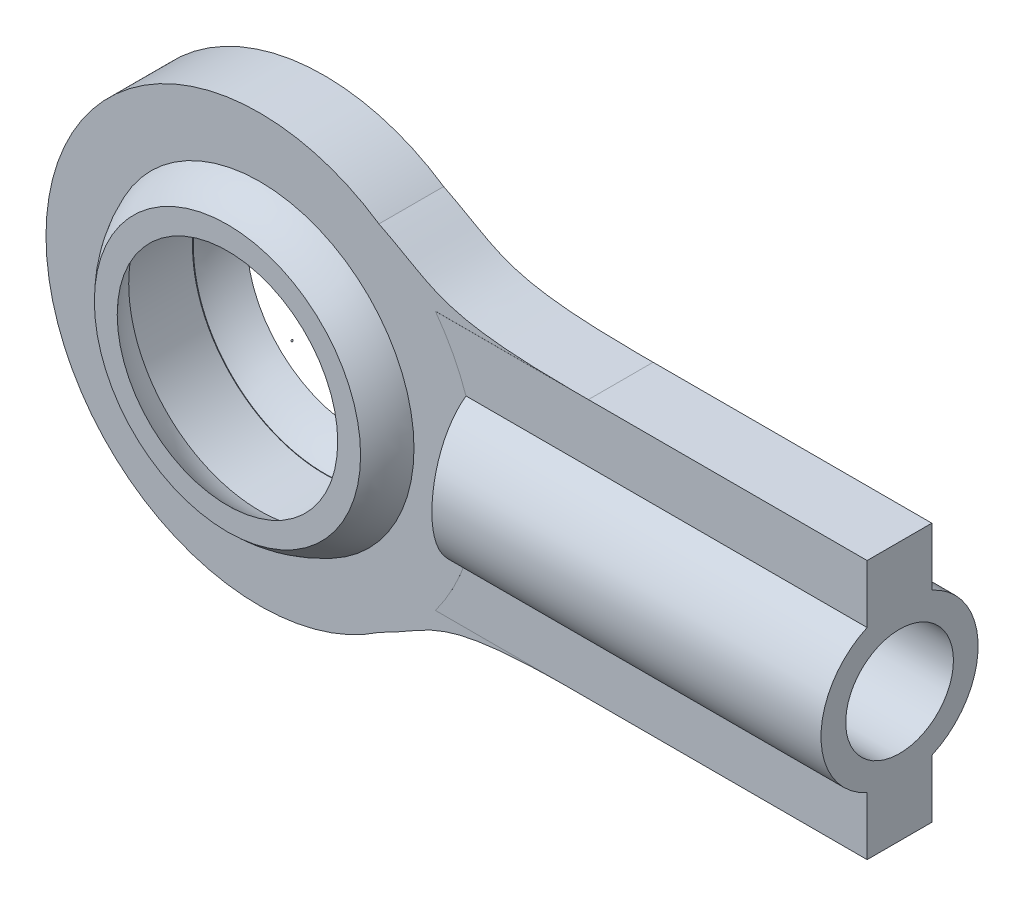
ISO-10303-21;
HEADER;
FILE_DESCRIPTION(('STEP AP214'),'2;1');
FILE_NAME('part.step','',(''),(''),'','','');
FILE_SCHEMA(('AUTOMOTIVE_DESIGN { 1 0 10303 214 1 1 1 1 }'));
ENDSEC;
DATA;
#1=APPLICATION_CONTEXT('core data for automotive mechanical design processes');
#2=APPLICATION_PROTOCOL_DEFINITION('international standard','automotive_design',2000,#1);
#3=PRODUCT_CONTEXT('',#1,'mechanical');
#4=PRODUCT('Part','Part','',(#3));
#5=PRODUCT_RELATED_PRODUCT_CATEGORY('part','',(#4));
#6=PRODUCT_DEFINITION_FORMATION('','',#4);
#7=PRODUCT_DEFINITION_CONTEXT('part definition',#1,'design');
#8=PRODUCT_DEFINITION('design','',#6,#7);
#9=PRODUCT_DEFINITION_SHAPE('','',#8);
#10=(LENGTH_UNIT() NAMED_UNIT(*) SI_UNIT(.MILLI.,.METRE.));
#11=(NAMED_UNIT(*) PLANE_ANGLE_UNIT() SI_UNIT($,.RADIAN.));
#12=(NAMED_UNIT(*) SI_UNIT($,.STERADIAN.) SOLID_ANGLE_UNIT());
#13=UNCERTAINTY_MEASURE_WITH_UNIT(LENGTH_MEASURE(1.E-05),#10,'distance_accuracy_value','');
#14=(GEOMETRIC_REPRESENTATION_CONTEXT(3) GLOBAL_UNCERTAINTY_ASSIGNED_CONTEXT((#13)) GLOBAL_UNIT_ASSIGNED_CONTEXT((#10,
#11,#12)) REPRESENTATION_CONTEXT('',''));
#15=CARTESIAN_POINT('',(0.,0.,0.));
#16=DIRECTION('',(0.,0.,1.));
#17=DIRECTION('',(1.,0.,0.));
#18=AXIS2_PLACEMENT_3D('',#15,#16,#17);
#19=CARTESIAN_POINT('',(0.,0.,5.));
#20=DIRECTION('',(0.,1.,0.));
#21=DIRECTION('',(1.,0.,0.));
#22=AXIS2_PLACEMENT_3D('',#19,#20,#21);
#23=SPHERICAL_SURFACE('',#22,0.05);
#24=CARTESIAN_POINT('',(0.,0.05,5.));
#25=VERTEX_POINT('',#24);
#26=VERTEX_LOOP('',#25);
#27=FACE_BOUND('',#26,.T.);
#28=ADVANCED_FACE('F40',(#27),#23,.T.);
#29=CLOSED_SHELL('',(#28));
#30=MANIFOLD_SOLID_BREP('B2',#29);
#31=CARTESIAN_POINT('',(0.,0.,7.));
#32=DIRECTION('',(0.,0.,1.));
#33=DIRECTION('',(1.,0.,0.));
#34=AXIS2_PLACEMENT_3D('',#31,#32,#33);
#35=PLANE('',#34);
#36=CARTESIAN_POINT('',(7.37205146484224,-10.9375023291297,7.));
#37=CARTESIAN_POINT('',(11.0593458509453,-9.11243969688908,7.));
#38=CARTESIAN_POINT('',(10.9360967991036,-7.96093691669476,7.));
#39=CARTESIAN_POINT('',(20.3264482536482,-8.00974694230661,7.));
#40=B_SPLINE_CURVE_WITH_KNOTS('',3,(#36,#37,#38,#39),.UNSPECIFIED.,.F.,.F.,(4,4),(0.,1.),.UNSPECIFIED.);
#41=CARTESIAN_POINT('',(7.37205146484224,-10.9375023291297,7.));
#42=VERTEX_POINT('',#41);
#43=CARTESIAN_POINT('',(19.2208446692394,-8.00974694230661,7.));
#44=VERTEX_POINT('',#43);
#45=EDGE_CURVE('E209',#42,#44,#40,.T.);
#46=ORIENTED_EDGE('',*,*,#45,.T.);
#47=DIRECTION('',(-1.,0.,0.));
#48=VECTOR('',#47,1.);
#49=CARTESIAN_POINT('',(37.55984811,-8.00974694230661,7.));
#50=LINE('',#49,#48);
#51=CARTESIAN_POINT('',(10.8671042104238,-8.00974694230661,7.));
#52=VERTEX_POINT('',#51);
#53=EDGE_CURVE('E944',#44,#52,#50,.T.);
#54=ORIENTED_EDGE('',*,*,#53,.T.);
#55=CARTESIAN_POINT('',(0.,0.,7.));
#56=DIRECTION('',(0.,0.,1.));
#57=DIRECTION('',(1.,0.,0.));
#58=AXIS2_PLACEMENT_3D('',#55,#56,#57);
#59=CIRCLE('',#58,13.5);
#60=CARTESIAN_POINT('',(10.8671042104238,8.00974694230661,7.));
#61=VERTEX_POINT('',#60);
#62=EDGE_CURVE('E430',#52,#61,#59,.T.);
#63=ORIENTED_EDGE('',*,*,#62,.T.);
#64=DIRECTION('',(-1.,0.,0.));
#65=VECTOR('',#64,1.);
#66=CARTESIAN_POINT('',(37.55984811,8.00974694230661,7.));
#67=LINE('',#66,#65);
#68=CARTESIAN_POINT('',(19.2208446691944,8.00974694230661,7.));
#69=VERTEX_POINT('',#68);
#70=EDGE_CURVE('E446',#69,#61,#67,.T.);
#71=ORIENTED_EDGE('',*,*,#70,.F.);
#72=CARTESIAN_POINT('',(20.3264482536482,8.00974694230661,7.));
#73=CARTESIAN_POINT('',(10.9360967991036,7.96093691669476,7.));
#74=CARTESIAN_POINT('',(11.0593458509453,9.11243969688909,7.));
#75=CARTESIAN_POINT('',(7.37205146484224,10.9375023291297,7.));
#76=B_SPLINE_CURVE_WITH_KNOTS('',3,(#72,#73,#74,#75),.UNSPECIFIED.,.F.,.F.,(4,4),(0.,1.),.UNSPECIFIED.);
#77=CARTESIAN_POINT('',(7.37205146484224,10.9375023291297,7.));
#78=VERTEX_POINT('',#77);
#79=EDGE_CURVE('E282',#69,#78,#76,.T.);
#80=ORIENTED_EDGE('',*,*,#79,.T.);
#81=CARTESIAN_POINT('',(-0.0169719174198894,0.,7.));
#82=DIRECTION('',(0.,0.,1.));
#83=DIRECTION('',(1.,0.,0.));
#84=AXIS2_PLACEMENT_3D('',#81,#82,#83);
#85=CIRCLE('',#84,13.1994933138865);
#86=EDGE_CURVE('E435',#78,#42,#85,.T.);
#87=ORIENTED_EDGE('',*,*,#86,.T.);
#88=EDGE_LOOP('',(#46,#54,#63,#71,#80,#87));
#89=FACE_BOUND('',#88,.T.);
#90=CARTESIAN_POINT('',(0.0106908193794938,0.,7.));
#91=DIRECTION('',(0.,0.,1.));
#92=DIRECTION('',(1.,0.,0.));
#93=AXIS2_PLACEMENT_3D('',#90,#91,#92);
#94=CIRCLE('',#93,9.52641269359551);
#95=CARTESIAN_POINT('',(9.537103512975,0.,7.));
#96=VERTEX_POINT('',#95);
#97=EDGE_CURVE('E951',#96,#96,#94,.F.);
#98=ORIENTED_EDGE('',*,*,#97,.T.);
#99=EDGE_LOOP('',(#98));
#100=FACE_BOUND('',#99,.T.);
#101=ADVANCED_FACE('F52',(#89,#100),#35,.T.);
#102=CARTESIAN_POINT('',(0.,0.,3.));
#103=DIRECTION('',(0.,0.,-1.));
#104=DIRECTION('',(-1.,0.,0.));
#105=AXIS2_PLACEMENT_3D('',#102,#103,#104);
#106=PLANE('',#105);
#107=DIRECTION('',(-1.,0.,0.));
#108=VECTOR('',#107,1.);
#109=CARTESIAN_POINT('',(0.,-8.00974694230661,3.));
#110=LINE('',#109,#108);
#111=CARTESIAN_POINT('',(19.220844669194,-8.00974694230661,3.));
#112=VERTEX_POINT('',#111);
#113=CARTESIAN_POINT('',(8.55982311,-8.00974694230661,3.));
#114=VERTEX_POINT('',#113);
#115=EDGE_CURVE('E212',#112,#114,#110,.T.);
#116=ORIENTED_EDGE('',*,*,#115,.F.);
#117=CARTESIAN_POINT('',(7.37205146484224,-10.9375023291297,3.));
#118=CARTESIAN_POINT('',(11.0593458509453,-9.11243969688908,3.));
#119=CARTESIAN_POINT('',(10.9360967991036,-7.96093691669476,3.));
#120=CARTESIAN_POINT('',(20.3264482536482,-8.00974694230661,3.));
#121=B_SPLINE_CURVE_WITH_KNOTS('',3,(#117,#118,#119,#120),.UNSPECIFIED.,.F.,.F.,(4,4),(0.,1.),.UNSPECIFIED.);
#122=CARTESIAN_POINT('',(7.37205146484224,-10.9375023291297,3.));
#123=VERTEX_POINT('',#122);
#124=EDGE_CURVE('E196',#112,#123,#121,.F.);
#125=ORIENTED_EDGE('',*,*,#124,.T.);
#126=CARTESIAN_POINT('',(-0.0169719174198894,0.,3.));
#127=DIRECTION('',(0.,0.,-1.));
#128=DIRECTION('',(-1.,0.,0.));
#129=AXIS2_PLACEMENT_3D('',#126,#127,#128);
#130=CIRCLE('',#129,13.1994933138865);
#131=CARTESIAN_POINT('',(7.37205146484224,10.9375023291297,3.));
#132=VERTEX_POINT('',#131);
#133=EDGE_CURVE('E422',#123,#132,#130,.T.);
#134=ORIENTED_EDGE('',*,*,#133,.T.);
#135=CARTESIAN_POINT('',(20.3264482536482,8.00974694230661,3.));
#136=CARTESIAN_POINT('',(10.9360967991036,7.96093691669476,3.));
#137=CARTESIAN_POINT('',(11.0593458509453,9.11243969688909,3.));
#138=CARTESIAN_POINT('',(7.37205146484224,10.9375023291297,3.));
#139=B_SPLINE_CURVE_WITH_KNOTS('',3,(#135,#136,#137,#138),.UNSPECIFIED.,.F.,.F.,(4,4),(0.,1.),.UNSPECIFIED.);
#140=CARTESIAN_POINT('',(19.2208446691942,8.00974694230661,3.));
#141=VERTEX_POINT('',#140);
#142=EDGE_CURVE('E423',#132,#141,#139,.F.);
#143=ORIENTED_EDGE('',*,*,#142,.T.);
#144=DIRECTION('',(1.,0.,0.));
#145=VECTOR('',#144,1.);
#146=CARTESIAN_POINT('',(0.,8.00974694230661,3.));
#147=LINE('',#146,#145);
#148=CARTESIAN_POINT('',(8.55982311,8.00974694230661,3.));
#149=VERTEX_POINT('',#148);
#150=EDGE_CURVE('E225',#149,#141,#147,.T.);
#151=ORIENTED_EDGE('',*,*,#150,.F.);
#152=DIRECTION('',(0.,1.,0.));
#153=VECTOR('',#152,1.);
#154=CARTESIAN_POINT('',(8.55982311,0.,3.));
#155=LINE('',#154,#153);
#156=CARTESIAN_POINT('',(8.55982311,4.4218515655031,3.));
#157=VERTEX_POINT('',#156);
#158=EDGE_CURVE('E239',#157,#149,#155,.T.);
#159=ORIENTED_EDGE('',*,*,#158,.F.);
#160=DIRECTION('',(1.,0.,0.));
#161=VECTOR('',#160,1.);
#162=CARTESIAN_POINT('',(8.55982311,4.42185156550309,3.));
#163=LINE('',#162,#161);
#164=CARTESIAN_POINT('',(12.7552823854534,4.4218515655031,3.));
#165=VERTEX_POINT('',#164);
#166=EDGE_CURVE('E220',#165,#157,#163,.F.);
#167=ORIENTED_EDGE('',*,*,#166,.F.);
#168=CARTESIAN_POINT('',(0.,0.,3.));
#169=DIRECTION('',(0.,0.,-1.));
#170=DIRECTION('',(-1.,0.,0.));
#171=AXIS2_PLACEMENT_3D('',#168,#169,#170);
#172=CIRCLE('',#171,13.5);
#173=CARTESIAN_POINT('',(12.7552823854534,-4.4218515655031,3.));
#174=VERTEX_POINT('',#173);
#175=EDGE_CURVE('E419',#165,#174,#172,.T.);
#176=ORIENTED_EDGE('',*,*,#175,.T.);
#177=DIRECTION('',(1.,0.,0.));
#178=VECTOR('',#177,1.);
#179=CARTESIAN_POINT('',(8.55982311,-4.42185156550309,3.));
#180=LINE('',#179,#178);
#181=CARTESIAN_POINT('',(8.55982311,-4.4218515655031,3.));
#182=VERTEX_POINT('',#181);
#183=EDGE_CURVE('E377',#182,#174,#180,.T.);
#184=ORIENTED_EDGE('',*,*,#183,.F.);
#185=EDGE_CURVE('E216',#114,#182,#155,.T.);
#186=ORIENTED_EDGE('',*,*,#185,.F.);
#187=EDGE_LOOP('',(#116,#125,#134,#143,#151,#159,#167,#176,#184,#186));
#188=FACE_BOUND('',#187,.T.);
#189=CARTESIAN_POINT('',(0.0106908193794938,0.,3.));
#190=DIRECTION('',(0.,0.,-1.));
#191=DIRECTION('',(-1.,0.,0.));
#192=AXIS2_PLACEMENT_3D('',#189,#190,#191);
#193=CIRCLE('',#192,9.52641269359551);
#194=CARTESIAN_POINT('',(-9.51572187421601,0.,3.));
#195=VERTEX_POINT('',#194);
#196=EDGE_CURVE('E235',#195,#195,#193,.F.);
#197=ORIENTED_EDGE('',*,*,#196,.T.);
#198=EDGE_LOOP('',(#197));
#199=FACE_BOUND('',#198,.T.);
#200=ADVANCED_FACE('F213',(#188,#199),#106,.T.);
#201=CARTESIAN_POINT('',(7.37205146484224,-10.9375023291297,10.));
#202=CARTESIAN_POINT('',(11.0593458509453,-9.11243969688908,10.));
#203=CARTESIAN_POINT('',(10.9360967991036,-7.96093691669476,10.));
#204=CARTESIAN_POINT('',(20.3264482536482,-8.00974694230661,10.));
#205=B_SPLINE_CURVE_WITH_KNOTS('',3,(#201,#202,#203,#204),.UNSPECIFIED.,.F.,.F.,(4,4),(0.,1.),.UNSPECIFIED.);
#206=DIRECTION('',(0.,0.,-1.));
#207=VECTOR('',#206,1.);
#208=SURFACE_OF_LINEAR_EXTRUSION('',#205,#207);
#209=ORIENTED_EDGE('',*,*,#124,.F.);
#210=DIRECTION('',(0.,0.,-1.));
#211=VECTOR('',#210,1.);
#212=CARTESIAN_POINT('',(19.220844669194,-8.00974694230661,10.));
#213=LINE('',#212,#211);
#214=CARTESIAN_POINT('',(19.2208447685526,-8.00974694230661,3.00370256567817));
#215=VERTEX_POINT('',#214);
#216=EDGE_CURVE('E201',#112,#215,#213,.F.);
#217=ORIENTED_EDGE('',*,*,#216,.T.);
#218=CARTESIAN_POINT('',(19.220844768551,-8.00974694174832,3.00370256567817));
#219=CARTESIAN_POINT('',(19.574065785448,-8.0077621827985,3.00370256567817));
#220=CARTESIAN_POINT('',(19.9422962045934,-8.00775016173412,3.00370256567817));
#221=CARTESIAN_POINT('',(20.3264482536482,-8.00974694230661,3.00370256567817));
#222=B_SPLINE_CURVE_WITH_KNOTS('',3,(#218,#219,#220,#221),.UNSPECIFIED.,.F.,.F.,(4,4),
(0.959090769827478,1.),.UNSPECIFIED.);
#223=CARTESIAN_POINT('',(20.3264482536482,-8.00974694230661,3.00370256567817));
#224=VERTEX_POINT('',#223);
#225=EDGE_CURVE('E243',#215,#224,#222,.T.);
#226=ORIENTED_EDGE('',*,*,#225,.T.);
#227=DIRECTION('',(0.,0.,-1.));
#228=VECTOR('',#227,1.);
#229=CARTESIAN_POINT('',(20.3264482536482,-8.00974694230661,10.));
#230=LINE('',#229,#228);
#231=CARTESIAN_POINT('',(20.3264482536482,-8.00974694230661,7.00411892586494));
#232=VERTEX_POINT('',#231);
#233=EDGE_CURVE('E285',#232,#224,#230,.T.);
#234=ORIENTED_EDGE('',*,*,#233,.F.);
#235=CARTESIAN_POINT('',(20.3264482536482,-8.00974694230661,7.00411892586494));
#236=CARTESIAN_POINT('',(19.9422961685742,-8.0077501615469,7.00411892586494));
#237=CARTESIAN_POINT('',(19.5740657163953,-8.00776218280075,7.00411892586494));
#238=CARTESIAN_POINT('',(19.220844669194,-8.00974694230661,7.00411892586494));
#239=B_SPLINE_CURVE_WITH_KNOTS('',3,(#235,#236,#237,#238),.UNSPECIFIED.,.F.,.F.,(4,4),
(0.959090765991712,1.),.UNSPECIFIED.);
#240=CARTESIAN_POINT('',(19.220844669194,-8.00974694230661,7.00411892586494));
#241=VERTEX_POINT('',#240);
#242=EDGE_CURVE('E523',#241,#232,#239,.F.);
#243=ORIENTED_EDGE('',*,*,#242,.F.);
#244=DIRECTION('',(0.,0.,-1.));
#245=VECTOR('',#244,1.);
#246=CARTESIAN_POINT('',(19.2208446692394,-8.00974694230635,10.));
#247=LINE('',#246,#245);
#248=EDGE_CURVE('E938',#44,#241,#247,.F.);
#249=ORIENTED_EDGE('',*,*,#248,.F.);
#250=ORIENTED_EDGE('',*,*,#45,.F.);
#251=DIRECTION('',(0.,0.,-1.));
#252=VECTOR('',#251,1.);
#253=CARTESIAN_POINT('',(7.37205146484224,-10.9375023291297,10.));
#254=LINE('',#253,#252);
#255=EDGE_CURVE('E205',#42,#123,#254,.T.);
#256=ORIENTED_EDGE('',*,*,#255,.T.);
#257=EDGE_LOOP('',(#209,#217,#226,#234,#243,#249,#250,#256));
#258=FACE_BOUND('',#257,.T.);
#259=ADVANCED_FACE('F198',(#258),#208,.F.);
#260=CARTESIAN_POINT('',(8.55982311,-8.00974694230661,10.));
#261=DIRECTION('',(0.,-1.,0.));
#262=DIRECTION('',(0.,0.,-1.));
#263=AXIS2_PLACEMENT_3D('',#260,#261,#262);
#264=PLANE('',#263);
#265=ORIENTED_EDGE('',*,*,#216,.F.);
#266=ORIENTED_EDGE('',*,*,#115,.T.);
#267=DIRECTION('',(0.,0.,-1.));
#268=VECTOR('',#267,1.);
#269=CARTESIAN_POINT('',(8.55982311,-8.00974694230661,10.));
#270=LINE('',#269,#268);
#271=CARTESIAN_POINT('',(8.55982311,-8.00974694230661,3.00370256567817));
#272=VERTEX_POINT('',#271);
#273=EDGE_CURVE('E383',#272,#114,#270,.T.);
#274=ORIENTED_EDGE('',*,*,#273,.F.);
#275=DIRECTION('',(1.,0.,0.));
#276=VECTOR('',#275,1.);
#277=CARTESIAN_POINT('',(8.55982311,-8.00974694230661,3.00370256567817));
#278=LINE('',#277,#276);
#279=EDGE_CURVE('E224',#272,#215,#278,.T.);
#280=ORIENTED_EDGE('',*,*,#279,.T.);
#281=EDGE_LOOP('',(#265,#266,#274,#280));
#282=FACE_BOUND('',#281,.T.);
#283=ADVANCED_FACE('F223',(#282),#264,.F.);
#284=CARTESIAN_POINT('',(20.3264482536482,8.00974694230661,10.));
#285=CARTESIAN_POINT('',(10.9360967991036,7.96093691669476,10.));
#286=CARTESIAN_POINT('',(11.0593458509453,9.11243969688909,10.));
#287=CARTESIAN_POINT('',(7.37205146484224,10.9375023291297,10.));
#288=B_SPLINE_CURVE_WITH_KNOTS('',3,(#284,#285,#286,#287),.UNSPECIFIED.,.F.,.F.,(4,4),(0.,1.),.UNSPECIFIED.);
#289=DIRECTION('',(0.,0.,-1.));
#290=VECTOR('',#289,1.);
#291=SURFACE_OF_LINEAR_EXTRUSION('',#288,#290);
#292=DIRECTION('',(0.,0.,-1.));
#293=VECTOR('',#292,1.);
#294=CARTESIAN_POINT('',(19.2208446691942,8.00974694230661,10.));
#295=LINE('',#294,#293);
#296=CARTESIAN_POINT('',(19.2208446691942,8.00974694230661,3.00370256567817));
#297=VERTEX_POINT('',#296);
#298=EDGE_CURVE('E228',#297,#141,#295,.T.);
#299=ORIENTED_EDGE('',*,*,#298,.T.);
#300=ORIENTED_EDGE('',*,*,#142,.F.);
#301=DIRECTION('',(0.,0.,-1.));
#302=VECTOR('',#301,1.);
#303=CARTESIAN_POINT('',(7.37205146484224,10.9375023291297,10.));
#304=LINE('',#303,#302);
#305=EDGE_CURVE('E294',#78,#132,#304,.T.);
#306=ORIENTED_EDGE('',*,*,#305,.F.);
#307=ORIENTED_EDGE('',*,*,#79,.F.);
#308=DIRECTION('',(0.,0.,-1.));
#309=VECTOR('',#308,1.);
#310=CARTESIAN_POINT('',(19.2208446691944,8.0097469423066,10.));
#311=LINE('',#310,#309);
#312=CARTESIAN_POINT('',(19.2208447810846,8.00974694230661,7.00411892586494));
#313=VERTEX_POINT('',#312);
#314=EDGE_CURVE('E930',#313,#69,#311,.T.);
#315=ORIENTED_EDGE('',*,*,#314,.F.);
#316=CARTESIAN_POINT('',(19.2208447810828,8.0097469416779,7.00411892586494));
#317=CARTESIAN_POINT('',(19.5740657941575,8.00776218279821,7.00411892586494));
#318=CARTESIAN_POINT('',(19.9422962091365,8.00775016175774,7.00411892586494));
#319=CARTESIAN_POINT('',(20.3264482536482,8.00974694230661,7.00411892586494));
#320=B_SPLINE_CURVE_WITH_KNOTS('',3,(#316,#317,#318,#319),.UNSPECIFIED.,.F.,.F.,(4,4),(0.,
0.0409092296887205),.UNSPECIFIED.);
#321=CARTESIAN_POINT('',(20.3264482536482,8.00974694230661,7.00411892586494));
#322=VERTEX_POINT('',#321);
#323=EDGE_CURVE('E395',#313,#322,#320,.T.);
#324=ORIENTED_EDGE('',*,*,#323,.T.);
#325=DIRECTION('',(0.,0.,-1.));
#326=VECTOR('',#325,1.);
#327=CARTESIAN_POINT('',(20.3264482536482,8.00974694230661,10.));
#328=LINE('',#327,#326);
#329=CARTESIAN_POINT('',(20.3264482536482,8.00974694230661,3.00370256567817));
#330=VERTEX_POINT('',#329);
#331=EDGE_CURVE('E279',#322,#330,#328,.T.);
#332=ORIENTED_EDGE('',*,*,#331,.T.);
#333=CARTESIAN_POINT('',(20.3264482536482,8.00974694230661,3.00370256567817));
#334=CARTESIAN_POINT('',(19.9422961685743,8.0077501615469,3.00370256567817));
#335=CARTESIAN_POINT('',(19.5740657163954,8.00776218280075,3.00370256567817));
#336=CARTESIAN_POINT('',(19.2208446691942,8.0097469423066,3.00370256567817));
#337=B_SPLINE_CURVE_WITH_KNOTS('',3,(#333,#334,#335,#336),.UNSPECIFIED.,.F.,.F.,(4,4),(0.,
0.0409092340082806),.UNSPECIFIED.);
#338=EDGE_CURVE('E425',#297,#330,#337,.F.);
#339=ORIENTED_EDGE('',*,*,#338,.F.);
#340=EDGE_LOOP('',(#299,#300,#306,#307,#315,#324,#332,#339));
#341=FACE_BOUND('',#340,.T.);
#342=ADVANCED_FACE('F54',(#341),#291,.F.);
#343=CARTESIAN_POINT('',(8.55982311,8.00974694230661,10.));
#344=DIRECTION('',(0.,1.,0.));
#345=DIRECTION('',(0.,0.,1.));
#346=AXIS2_PLACEMENT_3D('',#343,#344,#345);
#347=PLANE('',#346);
#348=ORIENTED_EDGE('',*,*,#150,.T.);
#349=ORIENTED_EDGE('',*,*,#298,.F.);
#350=DIRECTION('',(1.,0.,0.));
#351=VECTOR('',#350,1.);
#352=CARTESIAN_POINT('',(8.55982311,8.00974694230661,3.00370256567817));
#353=LINE('',#352,#351);
#354=CARTESIAN_POINT('',(8.55982311,8.00974694230661,3.00370256567817));
#355=VERTEX_POINT('',#354);
#356=EDGE_CURVE('E348',#355,#297,#353,.T.);
#357=ORIENTED_EDGE('',*,*,#356,.F.);
#358=DIRECTION('',(0.,0.,1.));
#359=VECTOR('',#358,1.);
#360=CARTESIAN_POINT('',(8.55982311,8.00974694230661,10.));
#361=LINE('',#360,#359);
#362=EDGE_CURVE('E379',#149,#355,#361,.T.);
#363=ORIENTED_EDGE('',*,*,#362,.F.);
#364=EDGE_LOOP('',(#348,#349,#357,#363));
#365=FACE_BOUND('',#364,.T.);
#366=ADVANCED_FACE('F457',(#365),#347,.F.);
#367=CARTESIAN_POINT('',(0.,0.,7.));
#368=DIRECTION('',(0.,0.,1.));
#369=DIRECTION('',(1.,0.,0.));
#370=AXIS2_PLACEMENT_3D('',#367,#368,#369);
#371=CYLINDRICAL_SURFACE('',#370,13.5);
#372=DIRECTION('',(0.,0.,1.));
#373=VECTOR('',#372,1.);
#374=CARTESIAN_POINT('',(10.8671042104238,-8.00974694230661,7.));
#375=LINE('',#374,#373);
#376=CARTESIAN_POINT('',(10.8671042104238,-8.0097469423066,7.00411892586494));
#377=VERTEX_POINT('',#376);
#378=EDGE_CURVE('E940',#377,#52,#375,.F.);
#379=ORIENTED_EDGE('',*,*,#378,.F.);
#380=CARTESIAN_POINT('',(0.,0.,7.00411892586494));
#381=DIRECTION('',(0.,0.,-1.));
#382=DIRECTION('',(-1.,0.,0.));
#383=AXIS2_PLACEMENT_3D('',#380,#381,#382);
#384=CIRCLE('',#383,13.5);
#385=CARTESIAN_POINT('',(12.7559326778641,-4.41997528474984,7.00411892586494));
#386=VERTEX_POINT('',#385);
#387=EDGE_CURVE('E460',#377,#386,#384,.F.);
#388=ORIENTED_EDGE('',*,*,#387,.T.);
#389=CARTESIAN_POINT('',(12.7559326778641,-4.41997528474984,7.00411892586494));
#390=CARTESIAN_POINT('',(12.775705650682,-4.36289578377834,7.13029864547706));
#391=CARTESIAN_POINT('',(12.7969051174868,-4.30049207015343,7.2538191842831));
#392=CARTESIAN_POINT('',(12.8414557879072,-4.16558435745821,7.49477085575706));
#393=CARTESIAN_POINT('',(12.8648064637079,-4.09308283373741,7.61220347114995));
#394=CARTESIAN_POINT('',(12.9129642212096,-3.9385134287035,7.84024971511158));
#395=CARTESIAN_POINT('',(12.9377710337109,-3.85644731287382,7.95086459638923));
#396=CARTESIAN_POINT('',(12.9881173733226,-3.6833345347328,8.16460687199905));
#397=CARTESIAN_POINT('',(13.0136569391162,-3.59228739767969,8.26773387001678));
#398=CARTESIAN_POINT('',(13.0902783046206,-3.30656347783153,8.56485920212877));
#399=CARTESIAN_POINT('',(13.1414217769601,-3.09912295664896,8.74686853850512));
#400=CARTESIAN_POINT('',(13.2381529727527,-2.65570424252907,9.07354590740568));
#401=CARTESIAN_POINT('',(13.2837417611495,-2.41973153711903,9.21822110359359));
#402=CARTESIAN_POINT('',(13.3643506131678,-1.92528549634709,9.46583023492882));
#403=CARTESIAN_POINT('',(13.3993795128284,-1.66683120723684,9.56879909299111));
#404=CARTESIAN_POINT('',(13.4548840102074,-1.13469172454707,9.72926822734534));
#405=CARTESIAN_POINT('',(13.4753645642969,-0.861011752392736,9.78678398947713));
#406=CARTESIAN_POINT('',(13.4987196965146,-0.321776504454009,9.85218563140119));
#407=CARTESIAN_POINT('',(13.5024675839306,-0.0565563115605997,9.86253390951769));
#408=CARTESIAN_POINT('',(13.4943398772328,0.471751344683003,9.83990000934661));
#409=CARTESIAN_POINT('',(13.4824668874726,0.734839156192088,9.80692505402321));
#410=CARTESIAN_POINT('',(13.4449075910056,1.24418758295289,9.70042592714622));
#411=CARTESIAN_POINT('',(13.4195991631196,1.49071004643317,9.62800968175307));
#412=CARTESIAN_POINT('',(13.3579429130185,1.96808170581312,9.44587878996692));
#413=CARTESIAN_POINT('',(13.3215928880393,2.19892776306482,9.33615670065309));
#414=CARTESIAN_POINT('',(13.2398821150292,2.64752592214533,9.07806959837262));
#415=CARTESIAN_POINT('',(13.194244284491,2.86450836585545,8.92845657223373));
#416=CARTESIAN_POINT('',(13.0993953356079,3.2710042955779,8.59665291898449));
#417=CARTESIAN_POINT('',(13.0501839718066,3.4605158920078,8.41446005279307));
#418=CARTESIAN_POINT('',(12.9569577532659,3.7940535247645,8.03726896788594));
#419=CARTESIAN_POINT('',(12.9128407308412,3.94049747364894,7.84443911298701));
#420=CARTESIAN_POINT('',(12.8504740543675,4.13764188681566,7.5400582479703));
#421=CARTESIAN_POINT('',(12.8303162985741,4.19961330984447,7.43605282386376));
#422=CARTESIAN_POINT('',(12.7917203160716,4.31573986599587,7.2234288874175));
#423=CARTESIAN_POINT('',(12.7732825010558,4.36989312941621,7.11480927961366));
#424=CARTESIAN_POINT('',(12.7559326778641,4.41997528474984,7.00411892586494));
#425=B_SPLINE_CURVE_WITH_KNOTS('',3,(#389,#390,#391,#392,#393,#394,#395,#396,#397,#398,#399,
#400,#401,#402,#403,#404,#405,#406,#407,#408,#409,#410,#411,#412,#413,#414,#415,#416,#417,#418,
#419,#420,#421,#422,#423,#424),.UNSPECIFIED.,.F.,.F.,(4,2,2,2,2,2,2,2,2,2,2,2,2,2,2,2,2,4),(0.,
0.419512140404784,0.838921623164709,1.25825381133197,1.67760817752219,2.51534571752146,
3.35292239296646,4.18979626414018,5.0263848898683,5.81875773953437,6.61099849946371,
7.38205357846034,8.15326258167202,8.95221172531813,9.75121579863581,10.4867213559907,
10.8546222441826,11.2226109701452),.UNSPECIFIED.);
#426=CARTESIAN_POINT('',(12.7559326778641,4.41997528474984,7.00411892586494));
#427=VERTEX_POINT('',#426);
#428=EDGE_CURVE('E462',#386,#427,#425,.T.);
#429=ORIENTED_EDGE('',*,*,#428,.T.);
#430=CARTESIAN_POINT('',(0.,0.,7.00411892586494));
#431=DIRECTION('',(0.,0.,-1.));
#432=DIRECTION('',(-1.,0.,0.));
#433=AXIS2_PLACEMENT_3D('',#430,#431,#432);
#434=CIRCLE('',#433,13.5);
#435=CARTESIAN_POINT('',(10.8671042104238,8.0097469423066,7.00411892586494));
#436=VERTEX_POINT('',#435);
#437=EDGE_CURVE('E283',#427,#436,#434,.F.);
#438=ORIENTED_EDGE('',*,*,#437,.T.);
#439=DIRECTION('',(0.,0.,1.));
#440=VECTOR('',#439,1.);
#441=CARTESIAN_POINT('',(10.8671042104238,8.00974694230661,7.));
#442=LINE('',#441,#440);
#443=EDGE_CURVE('E923',#61,#436,#442,.T.);
#444=ORIENTED_EDGE('',*,*,#443,.F.);
#445=ORIENTED_EDGE('',*,*,#62,.F.);
#446=EDGE_LOOP('',(#379,#388,#429,#438,#444,#445));
#447=FACE_BOUND('',#446,.T.);
#448=ADVANCED_FACE('F476',(#447),#371,.F.);
#449=CARTESIAN_POINT('',(-0.0169719174198894,0.,10.));
#450=DIRECTION('',(0.,0.,-1.));
#451=DIRECTION('',(-1.,0.,0.));
#452=AXIS2_PLACEMENT_3D('',#449,#450,#451);
#453=CYLINDRICAL_SURFACE('',#452,13.1994933138865);
#454=ORIENTED_EDGE('',*,*,#133,.F.);
#455=ORIENTED_EDGE('',*,*,#255,.F.);
#456=ORIENTED_EDGE('',*,*,#86,.F.);
#457=ORIENTED_EDGE('',*,*,#305,.T.);
#458=EDGE_LOOP('',(#454,#455,#456,#457));
#459=FACE_BOUND('',#458,.T.);
#460=ADVANCED_FACE('F261',(#459),#453,.T.);
#461=CARTESIAN_POINT('',(37.55982311,-8.00974694230661,10.));
#462=DIRECTION('',(0.,1.,0.));
#463=DIRECTION('',(0.,0.,1.));
#464=AXIS2_PLACEMENT_3D('',#461,#462,#463);
#465=PLANE('',#464);
#466=ORIENTED_EDGE('',*,*,#233,.T.);
#467=CARTESIAN_POINT('',(37.55982311,-8.00974694230661,3.00370256567817));
#468=VERTEX_POINT('',#467);
#469=EDGE_CURVE('E362',#224,#468,#278,.T.);
#470=ORIENTED_EDGE('',*,*,#469,.T.);
#471=DIRECTION('',(0.,0.,-1.));
#472=VECTOR('',#471,1.);
#473=CARTESIAN_POINT('',(37.55982311,-8.00974694230661,10.));
#474=LINE('',#473,#472);
#475=CARTESIAN_POINT('',(37.55982311,-8.00974694230661,7.00411892586494));
#476=VERTEX_POINT('',#475);
#477=EDGE_CURVE('E288',#476,#468,#474,.T.);
#478=ORIENTED_EDGE('',*,*,#477,.F.);
#479=DIRECTION('',(1.,0.,0.));
#480=VECTOR('',#479,1.);
#481=CARTESIAN_POINT('',(8.55982311,-8.00974694230661,7.00411892586494));
#482=LINE('',#481,#480);
#483=EDGE_CURVE('E501',#232,#476,#482,.T.);
#484=ORIENTED_EDGE('',*,*,#483,.F.);
#485=EDGE_LOOP('',(#466,#470,#478,#484));
#486=FACE_BOUND('',#485,.T.);
#487=ADVANCED_FACE('F259',(#486),#465,.F.);
#488=CARTESIAN_POINT('',(37.55982311,-8.00974694230661,10.));
#489=DIRECTION('',(-1.,0.,0.));
#490=DIRECTION('',(0.,0.,1.));
#491=AXIS2_PLACEMENT_3D('',#488,#489,#490);
#492=PLANE('',#491);
#493=CARTESIAN_POINT('',(37.55982311,0.,4.99740952804584));
#494=DIRECTION('',(1.,0.,0.));
#495=DIRECTION('',(0.,0.,-1.));
#496=AXIS2_PLACEMENT_3D('',#493,#494,#495);
#497=CIRCLE('',#496,3.33);
#498=CARTESIAN_POINT('',(37.55982311,0.,1.66740952804584));
#499=VERTEX_POINT('',#498);
#500=EDGE_CURVE('E948',#499,#499,#497,.T.);
#501=ORIENTED_EDGE('',*,*,#500,.F.);
#502=EDGE_LOOP('',(#501));
#503=FACE_BOUND('',#502,.T.);
#504=DIRECTION('',(0.,0.,-1.));
#505=VECTOR('',#504,1.);
#506=CARTESIAN_POINT('',(37.55982311,8.00974694230661,10.));
#507=LINE('',#506,#505);
#508=CARTESIAN_POINT('',(37.55982311,8.00974694230661,7.00411892586494));
#509=VERTEX_POINT('',#508);
#510=CARTESIAN_POINT('',(37.55982311,8.00974694230661,3.00370256567817));
#511=VERTEX_POINT('',#510);
#512=EDGE_CURVE('E276',#509,#511,#507,.T.);
#513=ORIENTED_EDGE('',*,*,#512,.F.);
#514=DIRECTION('',(0.,1.,0.));
#515=VECTOR('',#514,1.);
#516=CARTESIAN_POINT('',(37.55982311,-8.00974694230661,7.00411892586494));
#517=LINE('',#516,#515);
#518=CARTESIAN_POINT('',(37.55982311,4.41997528474984,7.00411892586494));
#519=VERTEX_POINT('',#518);
#520=EDGE_CURVE('E509',#519,#509,#517,.T.);
#521=ORIENTED_EDGE('',*,*,#520,.F.);
#522=CARTESIAN_POINT('',(37.55982311,0.,5.00434276013208));
#523=DIRECTION('',(-1.,0.,0.));
#524=DIRECTION('',(0.,0.,1.));
#525=AXIS2_PLACEMENT_3D('',#522,#523,#524);
#526=CIRCLE('',#525,4.85131798904511);
#527=CARTESIAN_POINT('',(37.55982311,-4.41997528474984,7.00411892586494));
#528=VERTEX_POINT('',#527);
#529=EDGE_CURVE('E928',#528,#519,#526,.T.);
#530=ORIENTED_EDGE('',*,*,#529,.F.);
#531=DIRECTION('',(0.,1.,0.));
#532=VECTOR('',#531,1.);
#533=CARTESIAN_POINT('',(37.55982311,-8.00974694230661,7.00411892586494));
#534=LINE('',#533,#532);
#535=EDGE_CURVE('E929',#476,#528,#534,.T.);
#536=ORIENTED_EDGE('',*,*,#535,.F.);
#537=ORIENTED_EDGE('',*,*,#477,.T.);
#538=DIRECTION('',(0.,-1.,0.));
#539=VECTOR('',#538,1.);
#540=CARTESIAN_POINT('',(37.55982311,-8.00974694230661,3.00370256567817));
#541=LINE('',#540,#539);
#542=CARTESIAN_POINT('',(37.55982311,-4.42351339328023,3.00370256567817));
#543=VERTEX_POINT('',#542);
#544=EDGE_CURVE('E353',#543,#468,#541,.T.);
#545=ORIENTED_EDGE('',*,*,#544,.F.);
#546=CARTESIAN_POINT('',(37.55982311,0.,4.98689009984764));
#547=DIRECTION('',(-1.,0.,0.));
#548=DIRECTION('',(0.,0.,1.));
#549=AXIS2_PLACEMENT_3D('',#546,#547,#548);
#550=CIRCLE('',#549,4.84773179293314);
#551=CARTESIAN_POINT('',(37.55982311,4.42351339328023,3.00370256567817));
#552=VERTEX_POINT('',#551);
#553=EDGE_CURVE('E394',#552,#543,#550,.T.);
#554=ORIENTED_EDGE('',*,*,#553,.F.);
#555=DIRECTION('',(0.,-1.,0.));
#556=VECTOR('',#555,1.);
#557=CARTESIAN_POINT('',(37.55982311,-8.00974694230661,3.00370256567817));
#558=LINE('',#557,#556);
#559=EDGE_CURVE('E393',#511,#552,#558,.T.);
#560=ORIENTED_EDGE('',*,*,#559,.F.);
#561=EDGE_LOOP('',(#513,#521,#530,#536,#537,#545,#554,#560));
#562=FACE_BOUND('',#561,.T.);
#563=ADVANCED_FACE('F551',(#503,#562),#492,.F.);
#564=CARTESIAN_POINT('',(37.55982311,8.00974694230661,10.));
#565=DIRECTION('',(0.,-1.,0.));
#566=DIRECTION('',(0.,0.,-1.));
#567=AXIS2_PLACEMENT_3D('',#564,#565,#566);
#568=PLANE('',#567);
#569=ORIENTED_EDGE('',*,*,#512,.T.);
#570=EDGE_CURVE('E339',#330,#511,#353,.T.);
#571=ORIENTED_EDGE('',*,*,#570,.F.);
#572=ORIENTED_EDGE('',*,*,#331,.F.);
#573=DIRECTION('',(1.,0.,0.));
#574=VECTOR('',#573,1.);
#575=CARTESIAN_POINT('',(8.55982311,8.00974694230661,7.00411892586494));
#576=LINE('',#575,#574);
#577=EDGE_CURVE('E409',#322,#509,#576,.T.);
#578=ORIENTED_EDGE('',*,*,#577,.T.);
#579=EDGE_LOOP('',(#569,#571,#572,#578));
#580=FACE_BOUND('',#579,.T.);
#581=ADVANCED_FACE('F549',(#580),#568,.F.);
#582=CARTESIAN_POINT('',(0.,0.,3.));
#583=DIRECTION('',(0.,0.,-1.));
#584=DIRECTION('',(-1.,0.,0.));
#585=AXIS2_PLACEMENT_3D('',#582,#583,#584);
#586=CYLINDRICAL_SURFACE('',#585,13.5);
#587=ORIENTED_EDGE('',*,*,#175,.F.);
#588=CARTESIAN_POINT('',(12.7552823854534,4.4218515655031,3.));
#589=CARTESIAN_POINT('',(12.774935527352,4.36514459664939,2.87377695730385));
#590=CARTESIAN_POINT('',(12.7960224569886,4.30311134025855,2.75019724271808));
#591=CARTESIAN_POINT('',(12.8403649788226,4.16893913374575,2.5090973092696));
#592=CARTESIAN_POINT('',(12.8636200327747,4.09680268955856,2.39157559767436));
#593=CARTESIAN_POINT('',(12.9116052019751,3.94295875628891,2.16332556297396));
#594=CARTESIAN_POINT('',(12.9363350022133,3.86125330760521,2.05259579926695));
#595=CARTESIAN_POINT('',(12.9865482654241,3.68885418142645,1.83859522711356));
#596=CARTESIAN_POINT('',(13.0120317687126,3.5981600225074,1.73532481869352));
#597=CARTESIAN_POINT('',(13.0885177031279,3.31348438481841,1.43773021867074));
#598=CARTESIAN_POINT('',(13.1396151095934,3.10672705045635,1.2553523341792));
#599=CARTESIAN_POINT('',(13.2363499619448,2.66462171845772,0.92782150205556));
#600=CARTESIAN_POINT('',(13.2819883895947,2.42927887713978,0.782661855565627));
#601=CARTESIAN_POINT('',(13.3628089574343,1.9358986011625,0.533910954191124));
#602=CARTESIAN_POINT('',(13.3979949223861,1.67786951274985,0.430304489308266));
#603=CARTESIAN_POINT('',(13.4538795164003,1.14646035925384,0.268499971305586));
#604=CARTESIAN_POINT('',(13.4745830981821,0.873085576710089,0.210286393837212));
#605=CARTESIAN_POINT('',(13.4984135487821,0.334250224464371,0.143485099734797));
#606=CARTESIAN_POINT('',(13.5024082859849,0.0691305627395457,0.132446388071822));
#607=CARTESIAN_POINT('',(13.4947753100506,-0.459102219207552,0.153716134417193));
#608=CARTESIAN_POINT('',(13.4831502150113,-0.72221566826518,0.186017328063075));
#609=CARTESIAN_POINT('',(13.4460642364228,-1.23161484099407,0.291205101080732));
#610=CARTESIAN_POINT('',(13.420987846659,-1.47816354016594,0.362965149040148));
#611=CARTESIAN_POINT('',(13.3597637891274,-1.95568879299038,0.543804941943743));
#612=CARTESIAN_POINT('',(13.3236140199025,-2.18666238070647,0.652891771060621));
#613=CARTESIAN_POINT('',(13.2422792201499,-2.63551372847482,0.909662975907694));
#614=CARTESIAN_POINT('',(13.196818860258,-2.85263488492267,1.05858073337888));
#615=CARTESIAN_POINT('',(13.1022595076567,-3.2595232520636,1.38900939009912));
#616=CARTESIAN_POINT('',(13.0531601527933,-3.4492877346613,1.57052353591699));
#617=CARTESIAN_POINT('',(12.9592900331123,-3.78621922640849,1.94959597371856));
#618=CARTESIAN_POINT('',(12.9144422239149,-3.93532444273565,2.14540683362935));
#619=CARTESIAN_POINT('',(12.8511043670261,-4.13570301503141,2.45477633774175));
#620=CARTESIAN_POINT('',(12.8306424771608,-4.19862962121507,2.56053855860034));
#621=CARTESIAN_POINT('',(12.7915035978125,-4.31639418990112,2.77682237222253));
#622=CARTESIAN_POINT('',(12.7728270326095,-4.37123023136617,2.88734508730341));
#623=CARTESIAN_POINT('',(12.7552823854534,-4.4218515655031,3.));
#624=B_SPLINE_CURVE_WITH_KNOTS('',3,(#588,#589,#590,#591,#592,#593,#594,#595,#596,#597,#598,
#599,#600,#601,#602,#603,#604,#605,#606,#607,#608,#609,#610,#611,#612,#613,#614,#615,#616,#617,
#618,#619,#620,#621,#622,#623),.UNSPECIFIED.,.F.,.F.,(4,2,2,2,2,2,2,2,2,2,2,2,2,2,2,2,2,4),(0.,
0.419123953681107,0.838144133842002,1.25707512845022,1.67602857261218,2.51295276403905,
3.3497262127542,4.18619309134814,5.02237377299651,5.81453794646878,6.6065693589479,
7.37708162488318,8.14774020593351,8.94577329199956,9.74388590551854,10.4913853850774,
10.8653339006556,11.2393710647987),.UNSPECIFIED.);
#625=EDGE_CURVE('E208',#165,#174,#624,.T.);
#626=ORIENTED_EDGE('',*,*,#625,.T.);
#627=EDGE_LOOP('',(#587,#626));
#628=FACE_BOUND('',#627,.T.);
#629=ADVANCED_FACE('F313',(#628),#586,.F.);
#630=CARTESIAN_POINT('',(8.55982311,-8.00974694230661,3.00370256567817));
#631=DIRECTION('',(0.,0.,1.));
#632=DIRECTION('',(1.,0.,0.));
#633=AXIS2_PLACEMENT_3D('',#630,#631,#632);
#634=PLANE('',#633);
#635=ORIENTED_EDGE('',*,*,#279,.F.);
#636=DIRECTION('',(0.,-1.,0.));
#637=VECTOR('',#636,1.);
#638=CARTESIAN_POINT('',(8.55982311,-8.00974694230661,3.00370256567817));
#639=LINE('',#638,#637);
#640=CARTESIAN_POINT('',(8.55982311,-4.42351339328023,3.00370256567817));
#641=VERTEX_POINT('',#640);
#642=EDGE_CURVE('E389',#641,#272,#639,.T.);
#643=ORIENTED_EDGE('',*,*,#642,.F.);
#644=DIRECTION('',(1.,0.,0.));
#645=VECTOR('',#644,1.);
#646=CARTESIAN_POINT('',(8.55982311,-4.42351339328023,3.00370256567817));
#647=LINE('',#646,#645);
#648=EDGE_CURVE('E358',#641,#543,#647,.T.);
#649=ORIENTED_EDGE('',*,*,#648,.T.);
#650=ORIENTED_EDGE('',*,*,#544,.T.);
#651=ORIENTED_EDGE('',*,*,#469,.F.);
#652=ORIENTED_EDGE('',*,*,#225,.F.);
#653=EDGE_LOOP('',(#635,#643,#649,#650,#651,#652));
#654=FACE_BOUND('',#653,.T.);
#655=ADVANCED_FACE('F325',(#654),#634,.F.);
#656=CARTESIAN_POINT('',(8.55982311,-8.00974694230661,3.00370256567817));
#657=DIRECTION('',(0.,0.,1.));
#658=DIRECTION('',(1.,0.,0.));
#659=AXIS2_PLACEMENT_3D('',#656,#657,#658);
#660=PLANE('',#659);
#661=ORIENTED_EDGE('',*,*,#570,.T.);
#662=ORIENTED_EDGE('',*,*,#559,.T.);
#663=DIRECTION('',(1.,0.,0.));
#664=VECTOR('',#663,1.);
#665=CARTESIAN_POINT('',(8.55982311,4.42351339328023,3.00370256567817));
#666=LINE('',#665,#664);
#667=CARTESIAN_POINT('',(8.55982311,4.42351339328023,3.00370256567817));
#668=VERTEX_POINT('',#667);
#669=EDGE_CURVE('E378',#668,#552,#666,.T.);
#670=ORIENTED_EDGE('',*,*,#669,.F.);
#671=DIRECTION('',(0.,-1.,0.));
#672=VECTOR('',#671,1.);
#673=CARTESIAN_POINT('',(8.55982311,-8.00974694230661,3.00370256567817));
#674=LINE('',#673,#672);
#675=EDGE_CURVE('E400',#355,#668,#674,.T.);
#676=ORIENTED_EDGE('',*,*,#675,.F.);
#677=ORIENTED_EDGE('',*,*,#356,.T.);
#678=ORIENTED_EDGE('',*,*,#338,.T.);
#679=EDGE_LOOP('',(#661,#662,#670,#676,#677,#678));
#680=FACE_BOUND('',#679,.T.);
#681=ADVANCED_FACE('F328',(#680),#660,.F.);
#682=CARTESIAN_POINT('',(8.55982311,0.,4.98689009984764));
#683=DIRECTION('',(-1.,0.,0.));
#684=DIRECTION('',(0.,0.,1.));
#685=AXIS2_PLACEMENT_3D('',#682,#683,#684);
#686=PLANE('',#685);
#687=ORIENTED_EDGE('',*,*,#185,.T.);
#688=CARTESIAN_POINT('',(8.55982311,0.,4.98689009984764));
#689=DIRECTION('',(-1.,0.,0.));
#690=DIRECTION('',(0.,0.,1.));
#691=AXIS2_PLACEMENT_3D('',#688,#689,#690);
#692=CIRCLE('',#691,4.84773179293314);
#693=EDGE_CURVE('E402',#182,#641,#692,.T.);
#694=ORIENTED_EDGE('',*,*,#693,.T.);
#695=ORIENTED_EDGE('',*,*,#642,.T.);
#696=ORIENTED_EDGE('',*,*,#273,.T.);
#697=EDGE_LOOP('',(#687,#694,#695,#696));
#698=FACE_BOUND('',#697,.T.);
#699=ADVANCED_FACE('F323',(#698),#686,.F.);
#700=CARTESIAN_POINT('',(8.55982311,0.,4.98689009984764));
#701=DIRECTION('',(1.,0.,0.));
#702=DIRECTION('',(0.,0.,-1.));
#703=AXIS2_PLACEMENT_3D('',#700,#701,#702);
#704=CYLINDRICAL_SURFACE('',#703,4.84773179293314);
#705=ORIENTED_EDGE('',*,*,#166,.T.);
#706=EDGE_CURVE('E406',#668,#157,#692,.T.);
#707=ORIENTED_EDGE('',*,*,#706,.F.);
#708=ORIENTED_EDGE('',*,*,#669,.T.);
#709=ORIENTED_EDGE('',*,*,#553,.T.);
#710=ORIENTED_EDGE('',*,*,#648,.F.);
#711=ORIENTED_EDGE('',*,*,#693,.F.);
#712=ORIENTED_EDGE('',*,*,#183,.T.);
#713=ORIENTED_EDGE('',*,*,#625,.F.);
#714=EDGE_LOOP('',(#705,#707,#708,#709,#710,#711,#712,#713));
#715=FACE_BOUND('',#714,.T.);
#716=ADVANCED_FACE('F317',(#715),#704,.T.);
#717=ORIENTED_EDGE('',*,*,#158,.T.);
#718=ORIENTED_EDGE('',*,*,#362,.T.);
#719=ORIENTED_EDGE('',*,*,#675,.T.);
#720=ORIENTED_EDGE('',*,*,#706,.T.);
#721=EDGE_LOOP('',(#717,#718,#719,#720));
#722=FACE_BOUND('',#721,.T.);
#723=ADVANCED_FACE('F322',(#722),#686,.F.);
#724=CARTESIAN_POINT('',(8.55982311,-8.00974694230661,7.00411892586494));
#725=DIRECTION('',(0.,0.,-1.));
#726=DIRECTION('',(-1.,0.,0.));
#727=AXIS2_PLACEMENT_3D('',#724,#725,#726);
#728=PLANE('',#727);
#729=EDGE_CURVE('E521',#436,#313,#576,.T.);
#730=ORIENTED_EDGE('',*,*,#729,.F.);
#731=ORIENTED_EDGE('',*,*,#437,.F.);
#732=DIRECTION('',(1.,0.,0.));
#733=VECTOR('',#732,1.);
#734=CARTESIAN_POINT('',(8.55982311,4.41997528474984,7.00411892586494));
#735=LINE('',#734,#733);
#736=EDGE_CURVE('E516',#427,#519,#735,.T.);
#737=ORIENTED_EDGE('',*,*,#736,.T.);
#738=ORIENTED_EDGE('',*,*,#520,.T.);
#739=ORIENTED_EDGE('',*,*,#577,.F.);
#740=ORIENTED_EDGE('',*,*,#323,.F.);
#741=EDGE_LOOP('',(#730,#731,#737,#738,#739,#740));
#742=FACE_BOUND('',#741,.T.);
#743=ADVANCED_FACE('F485',(#742),#728,.F.);
#744=CARTESIAN_POINT('',(8.55982311,0.,5.00434276013208));
#745=DIRECTION('',(1.,0.,0.));
#746=DIRECTION('',(0.,0.,-1.));
#747=AXIS2_PLACEMENT_3D('',#744,#745,#746);
#748=CYLINDRICAL_SURFACE('',#747,4.85131798904511);
#749=DIRECTION('',(1.,0.,0.));
#750=VECTOR('',#749,1.);
#751=CARTESIAN_POINT('',(8.55982311,-4.41997528474984,7.00411892586494));
#752=LINE('',#751,#750);
#753=EDGE_CURVE('E513',#386,#528,#752,.T.);
#754=ORIENTED_EDGE('',*,*,#753,.T.);
#755=ORIENTED_EDGE('',*,*,#529,.T.);
#756=ORIENTED_EDGE('',*,*,#736,.F.);
#757=ORIENTED_EDGE('',*,*,#428,.F.);
#758=EDGE_LOOP('',(#754,#755,#756,#757));
#759=FACE_BOUND('',#758,.T.);
#760=ADVANCED_FACE('F479',(#759),#748,.T.);
#761=CARTESIAN_POINT('',(8.55982311,-8.00974694230661,7.00411892586494));
#762=DIRECTION('',(0.,0.,-1.));
#763=DIRECTION('',(-1.,0.,0.));
#764=AXIS2_PLACEMENT_3D('',#761,#762,#763);
#765=PLANE('',#764);
#766=ORIENTED_EDGE('',*,*,#483,.T.);
#767=ORIENTED_EDGE('',*,*,#535,.T.);
#768=ORIENTED_EDGE('',*,*,#753,.F.);
#769=ORIENTED_EDGE('',*,*,#387,.F.);
#770=EDGE_CURVE('E508',#377,#241,#482,.T.);
#771=ORIENTED_EDGE('',*,*,#770,.T.);
#772=ORIENTED_EDGE('',*,*,#242,.T.);
#773=EDGE_LOOP('',(#766,#767,#768,#769,#771,#772));
#774=FACE_BOUND('',#773,.T.);
#775=ADVANCED_FACE('F484',(#774),#765,.F.);
#776=CARTESIAN_POINT('',(37.55984811,8.00974694230661,10.));
#777=DIRECTION('',(0.,1.,0.));
#778=DIRECTION('',(0.,0.,1.));
#779=AXIS2_PLACEMENT_3D('',#776,#777,#778);
#780=PLANE('',#779);
#781=ORIENTED_EDGE('',*,*,#314,.T.);
#782=ORIENTED_EDGE('',*,*,#70,.T.);
#783=ORIENTED_EDGE('',*,*,#443,.T.);
#784=ORIENTED_EDGE('',*,*,#729,.T.);
#785=EDGE_LOOP('',(#781,#782,#783,#784));
#786=FACE_BOUND('',#785,.T.);
#787=ADVANCED_FACE('F492',(#786),#780,.T.);
#788=CARTESIAN_POINT('',(37.55984811,-8.00974694230661,7.));
#789=DIRECTION('',(0.,-1.,0.));
#790=DIRECTION('',(0.,0.,-1.));
#791=AXIS2_PLACEMENT_3D('',#788,#789,#790);
#792=PLANE('',#791);
#793=ORIENTED_EDGE('',*,*,#248,.T.);
#794=ORIENTED_EDGE('',*,*,#770,.F.);
#795=ORIENTED_EDGE('',*,*,#378,.T.);
#796=ORIENTED_EDGE('',*,*,#53,.F.);
#797=EDGE_LOOP('',(#793,#794,#795,#796));
#798=FACE_BOUND('',#797,.T.);
#799=ADVANCED_FACE('F670',(#798),#792,.T.);
#800=CARTESIAN_POINT('',(13.55982311,0.,4.99740952804584));
#801=DIRECTION('',(1.,0.,0.));
#802=DIRECTION('',(0.,0.,-1.));
#803=AXIS2_PLACEMENT_3D('',#800,#801,#802);
#804=CYLINDRICAL_SURFACE('',#803,3.33);
#805=CARTESIAN_POINT('',(13.55982311,0.,4.99740952804584));
#806=DIRECTION('',(1.,0.,0.));
#807=DIRECTION('',(0.,0.,-1.));
#808=AXIS2_PLACEMENT_3D('',#805,#806,#807);
#809=CIRCLE('',#808,3.33);
#810=CARTESIAN_POINT('',(13.55982311,0.,1.66740952804584));
#811=VERTEX_POINT('',#810);
#812=EDGE_CURVE('E947',#811,#811,#809,.T.);
#813=ORIENTED_EDGE('',*,*,#812,.F.);
#814=EDGE_LOOP('',(#813));
#815=FACE_BOUND('',#814,.T.);
#816=ORIENTED_EDGE('',*,*,#500,.T.);
#817=EDGE_LOOP('',(#816));
#818=FACE_BOUND('',#817,.T.);
#819=ADVANCED_FACE('F677',(#815,#818),#804,.F.);
#820=CARTESIAN_POINT('',(13.55982311,0.,4.99740952804584));
#821=DIRECTION('',(1.,0.,0.));
#822=DIRECTION('',(0.,0.,-1.));
#823=AXIS2_PLACEMENT_3D('',#820,#821,#822);
#824=PLANE('',#823);
#825=ORIENTED_EDGE('',*,*,#812,.T.);
#826=EDGE_LOOP('',(#825));
#827=FACE_BOUND('',#826,.T.);
#828=ADVANCED_FACE('F684',(#827),#824,.T.);
#829=CARTESIAN_POINT('',(0.0106908193794938,0.,5.));
#830=DIRECTION('',(0.,0.,1.));
#831=DIRECTION('',(1.,0.,0.));
#832=AXIS2_PLACEMENT_3D('',#829,#830,#831);
#833=DEGENERATE_TOROIDAL_SURFACE('',#832,2.81088696402035,5.66609856050826,.T.);
#834=CARTESIAN_POINT('',(0.0106908193794938,0.,3.));
#835=DIRECTION('',(0.,0.,-1.));
#836=DIRECTION('',(-1.,0.,0.));
#837=AXIS2_PLACEMENT_3D('',#834,#835,#836);
#838=CIRCLE('',#837,8.11227101890582);
#839=CARTESIAN_POINT('',(8.12296183828531,0.,3.));
#840=VERTEX_POINT('',#839);
#841=EDGE_CURVE('E58',#840,#840,#838,.F.);
#842=ORIENTED_EDGE('',*,*,#841,.T.);
#843=EDGE_LOOP('',(#842));
#844=FACE_BOUND('',#843,.T.);
#845=CARTESIAN_POINT('',(0.0106908193794938,0.,0.993463284993276));
#846=DIRECTION('',(0.,0.,1.));
#847=DIRECTION('',(1.,0.,0.));
#848=AXIS2_PLACEMENT_3D('',#845,#846,#847);
#849=CIRCLE('',#848,6.81742367902709);
#850=CARTESIAN_POINT('',(6.82811449840658,0.,0.993463284993276));
#851=VERTEX_POINT('',#850);
#852=EDGE_CURVE('E956',#851,#851,#849,.T.);
#853=ORIENTED_EDGE('',*,*,#852,.F.);
#854=EDGE_LOOP('',(#853));
#855=FACE_BOUND('',#854,.T.);
#856=ADVANCED_FACE('F691',(#844,#855),#833,.F.);
#857=CARTESIAN_POINT('',(0.,0.,0.993463284993276));
#858=DIRECTION('',(0.,0.,-1.));
#859=DIRECTION('',(-1.,0.,0.));
#860=AXIS2_PLACEMENT_3D('',#857,#858,#859);
#861=PLANE('',#860);
#862=ORIENTED_EDGE('',*,*,#852,.T.);
#863=EDGE_LOOP('',(#862));
#864=FACE_BOUND('',#863,.T.);
#865=CARTESIAN_POINT('',(0.0106908193794938,0.,0.993463284993276));
#866=DIRECTION('',(0.,0.,1.));
#867=DIRECTION('',(1.,0.,0.));
#868=AXIS2_PLACEMENT_3D('',#865,#866,#867);
#869=CIRCLE('',#868,8.23156535371678);
#870=CARTESIAN_POINT('',(8.24225617309627,0.,0.993463284993276));
#871=VERTEX_POINT('',#870);
#872=EDGE_CURVE('E959',#871,#871,#869,.T.);
#873=ORIENTED_EDGE('',*,*,#872,.F.);
#874=EDGE_LOOP('',(#873));
#875=FACE_BOUND('',#874,.T.);
#876=ADVANCED_FACE('F698',(#864,#875),#861,.T.);
#877=CARTESIAN_POINT('',(0.0106908193794938,0.,5.));
#878=DIRECTION('',(0.,0.,1.));
#879=DIRECTION('',(1.,0.,0.));
#880=AXIS2_PLACEMENT_3D('',#877,#878,#879);
#881=DEGENERATE_TOROIDAL_SURFACE('',#880,4.22502863871005,5.66609856050826,.T.);
#882=ORIENTED_EDGE('',*,*,#196,.F.);
#883=EDGE_LOOP('',(#882));
#884=FACE_BOUND('',#883,.T.);
#885=ORIENTED_EDGE('',*,*,#872,.T.);
#886=EDGE_LOOP('',(#885));
#887=FACE_BOUND('',#886,.T.);
#888=ADVANCED_FACE('F708',(#884,#887),#881,.T.);
#889=CARTESIAN_POINT('',(0.0106908193794938,0.,7.));
#890=DIRECTION('',(0.,0.,1.));
#891=DIRECTION('',(1.,0.,0.));
#892=AXIS2_PLACEMENT_3D('',#889,#890,#891);
#893=CIRCLE('',#892,8.11227101890582);
#894=CARTESIAN_POINT('',(8.12296183828531,0.,7.00000000000025));
#895=VERTEX_POINT('',#894);
#896=EDGE_CURVE('E38',#895,#895,#893,.F.);
#897=ORIENTED_EDGE('',*,*,#896,.T.);
#898=EDGE_LOOP('',(#897));
#899=FACE_BOUND('',#898,.T.);
#900=CARTESIAN_POINT('',(0.0106908193794938,0.,9.00653671500672));
#901=DIRECTION('',(0.,0.,1.));
#902=DIRECTION('',(1.,0.,0.));
#903=AXIS2_PLACEMENT_3D('',#900,#901,#902);
#904=CIRCLE('',#903,6.81742367902709);
#905=CARTESIAN_POINT('',(6.82811449840658,0.,9.00653671500672));
#906=VERTEX_POINT('',#905);
#907=EDGE_CURVE('E965',#906,#906,#904,.T.);
#908=ORIENTED_EDGE('',*,*,#907,.T.);
#909=EDGE_LOOP('',(#908));
#910=FACE_BOUND('',#909,.T.);
#911=ADVANCED_FACE('F701',(#899,#910),#833,.F.);
#912=ORIENTED_EDGE('',*,*,#97,.F.);
#913=EDGE_LOOP('',(#912));
#914=FACE_BOUND('',#913,.T.);
#915=CARTESIAN_POINT('',(0.0106908193794938,0.,9.00653671500672));
#916=DIRECTION('',(0.,0.,1.));
#917=DIRECTION('',(1.,0.,0.));
#918=AXIS2_PLACEMENT_3D('',#915,#916,#917);
#919=CIRCLE('',#918,8.23156535371678);
#920=CARTESIAN_POINT('',(8.24225617309627,0.,9.00653671500672));
#921=VERTEX_POINT('',#920);
#922=EDGE_CURVE('E962',#921,#921,#919,.T.);
#923=ORIENTED_EDGE('',*,*,#922,.F.);
#924=EDGE_LOOP('',(#923));
#925=FACE_BOUND('',#924,.T.);
#926=ADVANCED_FACE('F718',(#914,#925),#881,.T.);
#927=CARTESIAN_POINT('',(0.,0.,9.00653671500672));
#928=DIRECTION('',(0.,0.,-1.));
#929=DIRECTION('',(-1.,0.,0.));
#930=AXIS2_PLACEMENT_3D('',#927,#928,#929);
#931=PLANE('',#930);
#932=ORIENTED_EDGE('',*,*,#907,.F.);
#933=EDGE_LOOP('',(#932));
#934=FACE_BOUND('',#933,.T.);
#935=ORIENTED_EDGE('',*,*,#922,.T.);
#936=EDGE_LOOP('',(#935));
#937=FACE_BOUND('',#936,.T.);
#938=ADVANCED_FACE('F730',(#934,#937),#931,.F.);
#939=CARTESIAN_POINT('',(-0.0169719174198894,0.,3.));
#940=DIRECTION('',(0.,0.,-1.));
#941=DIRECTION('',(-1.,0.,0.));
#942=AXIS2_PLACEMENT_3D('',#939,#940,#941);
#943=PLANE('',#942);
#944=CARTESIAN_POINT('',(-0.0169719174198894,0.,3.));
#945=DIRECTION('',(0.,0.,-1.));
#946=DIRECTION('',(-1.,0.,0.));
#947=AXIS2_PLACEMENT_3D('',#944,#945,#946);
#948=CIRCLE('',#947,8.1399337557052);
#949=EDGE_CURVE('E69',#840,#840,#948,.T.);
#950=ORIENTED_EDGE('',*,*,#949,.F.);
#951=ORIENTED_EDGE('',*,*,#841,.F.);
#952=EDGE_LOOP('',(#950,#951));
#953=FACE_BOUND('',#952,.T.);
#954=ADVANCED_FACE('F737',(#953),#943,.F.);
#955=CARTESIAN_POINT('',(0.,0.,7.));
#956=DIRECTION('',(0.,0.,1.));
#957=DIRECTION('',(1.,0.,0.));
#958=AXIS2_PLACEMENT_3D('',#955,#956,#957);
#959=PLANE('',#958);
#960=CARTESIAN_POINT('',(-0.0169719174198894,0.,7.));
#961=DIRECTION('',(0.,0.,1.));
#962=DIRECTION('',(1.,0.,0.));
#963=AXIS2_PLACEMENT_3D('',#960,#961,#962);
#964=CIRCLE('',#963,8.1399337557052);
#965=EDGE_CURVE('E74',#895,#895,#964,.F.);
#966=ORIENTED_EDGE('',*,*,#965,.T.);
#967=ORIENTED_EDGE('',*,*,#896,.F.);
#968=EDGE_LOOP('',(#966,#967));
#969=FACE_BOUND('',#968,.T.);
#970=ADVANCED_FACE('F744',(#969),#959,.F.);
#971=CARTESIAN_POINT('',(-0.0169719174198894,0.,30.0232094282737));
#972=DIRECTION('',(0.,0.,-1.));
#973=DIRECTION('',(-1.,0.,0.));
#974=AXIS2_PLACEMENT_3D('',#971,#972,#973);
#975=CYLINDRICAL_SURFACE('',#974,8.1399337557052);
#976=ORIENTED_EDGE('',*,*,#949,.T.);
#977=EDGE_LOOP('',(#976));
#978=FACE_BOUND('',#977,.T.);
#979=ORIENTED_EDGE('',*,*,#965,.F.);
#980=EDGE_LOOP('',(#979));
#981=FACE_BOUND('',#980,.T.);
#982=ADVANCED_FACE('F751',(#978,#981),#975,.F.);
#983=CLOSED_SHELL('',(#101,#200,#259,#283,#342,#366,#448,#460,#487,#563,#581,#629,#655,#681,
#699,#716,#723,#743,#760,#775,#787,#799,#819,#828,#856,#876,#888,#911,#926,#938,#954,#970,#982));
#984=MANIFOLD_SOLID_BREP('B6',#983);
#985=ADVANCED_BREP_SHAPE_REPRESENTATION('',(#18,#30,#984),#14);
#986=SHAPE_DEFINITION_REPRESENTATION(#9,#985);
ENDSEC;
END-ISO-10303-21;
